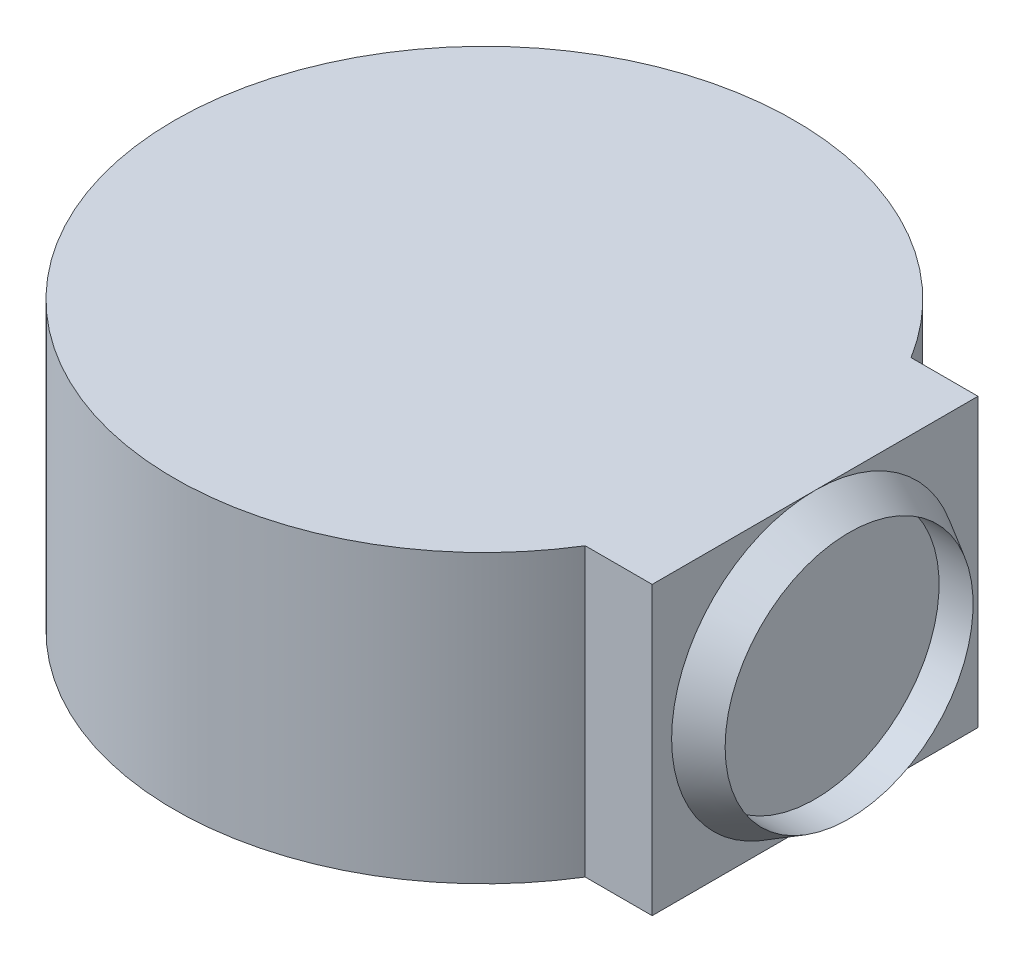
ISO-10303-21;
HEADER;
FILE_DESCRIPTION(('STEP AP214'),'2;1');
FILE_NAME('part.step','',(''),(''),'','','');
FILE_SCHEMA(('AUTOMOTIVE_DESIGN { 1 0 10303 214 1 1 1 1 }'));
ENDSEC;
DATA;
#1=APPLICATION_CONTEXT('core data for automotive mechanical design processes');
#2=APPLICATION_PROTOCOL_DEFINITION('international standard','automotive_design',2000,#1);
#3=PRODUCT_CONTEXT('',#1,'mechanical');
#4=PRODUCT('Part','Part','',(#3));
#5=PRODUCT_RELATED_PRODUCT_CATEGORY('part','',(#4));
#6=PRODUCT_DEFINITION_FORMATION('','',#4);
#7=PRODUCT_DEFINITION_CONTEXT('part definition',#1,'design');
#8=PRODUCT_DEFINITION('design','',#6,#7);
#9=PRODUCT_DEFINITION_SHAPE('','',#8);
#10=(LENGTH_UNIT() NAMED_UNIT(*) SI_UNIT(.MILLI.,.METRE.));
#11=(NAMED_UNIT(*) PLANE_ANGLE_UNIT() SI_UNIT($,.RADIAN.));
#12=(NAMED_UNIT(*) SI_UNIT($,.STERADIAN.) SOLID_ANGLE_UNIT());
#13=UNCERTAINTY_MEASURE_WITH_UNIT(LENGTH_MEASURE(1.E-05),#10,'distance_accuracy_value','');
#14=(GEOMETRIC_REPRESENTATION_CONTEXT(3) GLOBAL_UNCERTAINTY_ASSIGNED_CONTEXT((#13)) GLOBAL_UNIT_ASSIGNED_CONTEXT((#10,
#11,#12)) REPRESENTATION_CONTEXT('',''));
#15=CARTESIAN_POINT('',(0.,0.,0.));
#16=DIRECTION('',(0.,0.,1.));
#17=DIRECTION('',(1.,0.,0.));
#18=AXIS2_PLACEMENT_3D('',#15,#16,#17);
#19=CARTESIAN_POINT('',(170.,0.,0.));
#20=DIRECTION('',(1.,0.,0.));
#21=DIRECTION('',(0.,0.,-1.));
#22=AXIS2_PLACEMENT_3D('',#19,#20,#21);
#23=PLANE('',#22);
#24=DIRECTION('',(0.,0.,1.));
#25=VECTOR('',#24,1.);
#26=CARTESIAN_POINT('',(170.,147.5,-83.75));
#27=LINE('',#26,#25);
#28=CARTESIAN_POINT('',(170.,147.5,-83.75));
#29=VERTEX_POINT('',#28);
#30=CARTESIAN_POINT('',(170.,147.5,0.));
#31=VERTEX_POINT('',#30);
#32=EDGE_CURVE('E95',#29,#31,#27,.T.);
#33=ORIENTED_EDGE('',*,*,#32,.T.);
#34=CARTESIAN_POINT('',(170.,73.75,0.));
#35=DIRECTION('',(-1.,0.,0.));
#36=DIRECTION('',(0.,0.,1.));
#37=AXIS2_PLACEMENT_3D('',#34,#35,#36);
#38=CIRCLE('',#37,73.75);
#39=CARTESIAN_POINT('',(170.,0.,0.));
#40=VERTEX_POINT('',#39);
#41=EDGE_CURVE('E53',#31,#40,#38,.T.);
#42=ORIENTED_EDGE('',*,*,#41,.T.);
#43=DIRECTION('',(0.,0.,-1.));
#44=VECTOR('',#43,1.);
#45=CARTESIAN_POINT('',(170.,0.,83.75));
#46=LINE('',#45,#44);
#47=CARTESIAN_POINT('',(170.,0.,-83.75));
#48=VERTEX_POINT('',#47);
#49=EDGE_CURVE('E92',#40,#48,#46,.T.);
#50=ORIENTED_EDGE('',*,*,#49,.T.);
#51=DIRECTION('',(0.,1.,0.));
#52=VECTOR('',#51,1.);
#53=CARTESIAN_POINT('',(170.,0.,-83.75));
#54=LINE('',#53,#52);
#55=EDGE_CURVE('E112',#48,#29,#54,.T.);
#56=ORIENTED_EDGE('',*,*,#55,.T.);
#57=EDGE_LOOP('',(#33,#42,#50,#56));
#58=FACE_BOUND('',#57,.T.);
#59=ADVANCED_FACE('F39',(#58),#23,.T.);
#60=CARTESIAN_POINT('',(0.,147.5,0.));
#61=DIRECTION('',(0.,-1.,0.));
#62=DIRECTION('',(0.,0.,-1.));
#63=AXIS2_PLACEMENT_3D('',#60,#61,#62);
#64=CYLINDRICAL_SURFACE('',#63,159.375);
#65=DIRECTION('',(0.,-1.,0.));
#66=VECTOR('',#65,1.);
#67=CARTESIAN_POINT('',(135.596195097798,147.5,83.75));
#68=LINE('',#67,#66);
#69=CARTESIAN_POINT('',(135.596195097798,147.5,83.75));
#70=VERTEX_POINT('',#69);
#71=CARTESIAN_POINT('',(135.596195097798,0.,83.75));
#72=VERTEX_POINT('',#71);
#73=EDGE_CURVE('E61',#70,#72,#68,.T.);
#74=ORIENTED_EDGE('',*,*,#73,.F.);
#75=CARTESIAN_POINT('',(0.,147.5,0.));
#76=DIRECTION('',(0.,1.,0.));
#77=DIRECTION('',(0.,0.,1.));
#78=AXIS2_PLACEMENT_3D('',#75,#76,#77);
#79=CIRCLE('',#78,159.375);
#80=CARTESIAN_POINT('',(135.596195097798,147.5,-83.75));
#81=VERTEX_POINT('',#80);
#82=EDGE_CURVE('E131',#81,#70,#79,.T.);
#83=ORIENTED_EDGE('',*,*,#82,.F.);
#84=DIRECTION('',(0.,-1.,0.));
#85=VECTOR('',#84,1.);
#86=CARTESIAN_POINT('',(135.596195097798,147.5,-83.75));
#87=LINE('',#86,#85);
#88=CARTESIAN_POINT('',(135.596195097798,0.,-83.75));
#89=VERTEX_POINT('',#88);
#90=EDGE_CURVE('E126',#89,#81,#87,.F.);
#91=ORIENTED_EDGE('',*,*,#90,.F.);
#92=CARTESIAN_POINT('',(0.,0.,0.));
#93=DIRECTION('',(0.,1.,0.));
#94=DIRECTION('',(0.,0.,1.));
#95=AXIS2_PLACEMENT_3D('',#92,#93,#94);
#96=CIRCLE('',#95,159.375);
#97=EDGE_CURVE('E130',#89,#72,#96,.T.);
#98=ORIENTED_EDGE('',*,*,#97,.T.);
#99=EDGE_LOOP('',(#74,#83,#91,#98));
#100=FACE_BOUND('',#99,.T.);
#101=ADVANCED_FACE('F41',(#100),#64,.T.);
#102=CARTESIAN_POINT('',(0.,147.5,0.));
#103=DIRECTION('',(0.,1.,0.));
#104=DIRECTION('',(0.,0.,1.));
#105=AXIS2_PLACEMENT_3D('',#102,#103,#104);
#106=PLANE('',#105);
#107=ORIENTED_EDGE('',*,*,#82,.T.);
#108=DIRECTION('',(-1.,0.,0.));
#109=VECTOR('',#108,1.);
#110=CARTESIAN_POINT('',(170.,147.5,83.75));
#111=LINE('',#110,#109);
#112=CARTESIAN_POINT('',(170.,147.5,83.75));
#113=VERTEX_POINT('',#112);
#114=EDGE_CURVE('E123',#113,#70,#111,.T.);
#115=ORIENTED_EDGE('',*,*,#114,.F.);
#116=EDGE_CURVE('E96',#31,#113,#27,.T.);
#117=ORIENTED_EDGE('',*,*,#116,.F.);
#118=ORIENTED_EDGE('',*,*,#32,.F.);
#119=DIRECTION('',(-1.,0.,0.));
#120=VECTOR('',#119,1.);
#121=CARTESIAN_POINT('',(170.,147.5,-83.75));
#122=LINE('',#121,#120);
#123=EDGE_CURVE('E113',#29,#81,#122,.T.);
#124=ORIENTED_EDGE('',*,*,#123,.T.);
#125=EDGE_LOOP('',(#107,#115,#117,#118,#124));
#126=FACE_BOUND('',#125,.T.);
#127=ADVANCED_FACE('F136',(#126),#106,.T.);
#128=CARTESIAN_POINT('',(0.,0.,0.));
#129=DIRECTION('',(0.,1.,0.));
#130=DIRECTION('',(0.,0.,1.));
#131=AXIS2_PLACEMENT_3D('',#128,#129,#130);
#132=PLANE('',#131);
#133=CARTESIAN_POINT('',(0.,0.,0.));
#134=DIRECTION('',(0.,1.,0.));
#135=DIRECTION('',(0.,0.,1.));
#136=AXIS2_PLACEMENT_3D('',#133,#134,#135);
#137=CIRCLE('',#136,132.8125);
#138=CARTESIAN_POINT('',(0.,0.,132.8125));
#139=VERTEX_POINT('',#138);
#140=EDGE_CURVE('E11',#139,#139,#137,.F.);
#141=ORIENTED_EDGE('',*,*,#140,.F.);
#142=EDGE_LOOP('',(#141));
#143=FACE_BOUND('',#142,.T.);
#144=ORIENTED_EDGE('',*,*,#97,.F.);
#145=DIRECTION('',(-1.,0.,0.));
#146=VECTOR('',#145,1.);
#147=CARTESIAN_POINT('',(170.,0.,-83.75));
#148=LINE('',#147,#146);
#149=EDGE_CURVE('E105',#48,#89,#148,.T.);
#150=ORIENTED_EDGE('',*,*,#149,.F.);
#151=ORIENTED_EDGE('',*,*,#49,.F.);
#152=CARTESIAN_POINT('',(170.,0.,83.75));
#153=VERTEX_POINT('',#152);
#154=EDGE_CURVE('E103',#153,#40,#46,.T.);
#155=ORIENTED_EDGE('',*,*,#154,.F.);
#156=DIRECTION('',(-1.,0.,0.));
#157=VECTOR('',#156,1.);
#158=CARTESIAN_POINT('',(170.,0.,83.75));
#159=LINE('',#158,#157);
#160=EDGE_CURVE('E121',#153,#72,#159,.T.);
#161=ORIENTED_EDGE('',*,*,#160,.T.);
#162=EDGE_LOOP('',(#144,#150,#151,#155,#161));
#163=FACE_BOUND('',#162,.T.);
#164=ADVANCED_FACE('F101',(#143,#163),#132,.F.);
#165=CARTESIAN_POINT('',(170.,147.5,83.75));
#166=DIRECTION('',(0.,0.,-1.));
#167=DIRECTION('',(0.,1.,0.));
#168=AXIS2_PLACEMENT_3D('',#165,#166,#167);
#169=PLANE('',#168);
#170=ORIENTED_EDGE('',*,*,#114,.T.);
#171=ORIENTED_EDGE('',*,*,#73,.T.);
#172=ORIENTED_EDGE('',*,*,#160,.F.);
#173=DIRECTION('',(0.,-1.,0.));
#174=VECTOR('',#173,1.);
#175=CARTESIAN_POINT('',(170.,147.5,83.75));
#176=LINE('',#175,#174);
#177=EDGE_CURVE('E107',#113,#153,#176,.T.);
#178=ORIENTED_EDGE('',*,*,#177,.F.);
#179=EDGE_LOOP('',(#170,#171,#172,#178));
#180=FACE_BOUND('',#179,.T.);
#181=ADVANCED_FACE('F133',(#180),#169,.F.);
#182=CARTESIAN_POINT('',(170.,0.,-83.75));
#183=DIRECTION('',(0.,0.,1.));
#184=DIRECTION('',(1.,0.,0.));
#185=AXIS2_PLACEMENT_3D('',#182,#183,#184);
#186=PLANE('',#185);
#187=ORIENTED_EDGE('',*,*,#149,.T.);
#188=ORIENTED_EDGE('',*,*,#90,.T.);
#189=ORIENTED_EDGE('',*,*,#123,.F.);
#190=ORIENTED_EDGE('',*,*,#55,.F.);
#191=EDGE_LOOP('',(#187,#188,#189,#190));
#192=FACE_BOUND('',#191,.T.);
#193=ADVANCED_FACE('F139',(#192),#186,.F.);
#194=ORIENTED_EDGE('',*,*,#154,.T.);
#195=EDGE_CURVE('E47',#40,#31,#38,.T.);
#196=ORIENTED_EDGE('',*,*,#195,.T.);
#197=ORIENTED_EDGE('',*,*,#116,.T.);
#198=ORIENTED_EDGE('',*,*,#177,.T.);
#199=EDGE_LOOP('',(#194,#196,#197,#198));
#200=FACE_BOUND('',#199,.T.);
#201=ADVANCED_FACE('F109',(#200),#23,.T.);
#202=CARTESIAN_POINT('',(170.,73.75,0.));
#203=DIRECTION('',(-1.,0.,0.));
#204=DIRECTION('',(0.,0.,1.));
#205=AXIS2_PLACEMENT_3D('',#202,#203,#204);
#206=CONICAL_SURFACE('',#205,73.75,0.519146114246523);
#207=CARTESIAN_POINT('',(187.5,73.75,0.));
#208=DIRECTION('',(-1.,0.,0.));
#209=DIRECTION('',(0.,0.,1.));
#210=AXIS2_PLACEMENT_3D('',#207,#208,#209);
#211=CIRCLE('',#210,63.75);
#212=CARTESIAN_POINT('',(187.5,73.75,63.75));
#213=VERTEX_POINT('',#212);
#214=EDGE_CURVE('E97',#213,#213,#211,.T.);
#215=ORIENTED_EDGE('',*,*,#214,.T.);
#216=EDGE_LOOP('',(#215));
#217=FACE_BOUND('',#216,.T.);
#218=ORIENTED_EDGE('',*,*,#41,.F.);
#219=ORIENTED_EDGE('',*,*,#195,.F.);
#220=EDGE_LOOP('',(#218,#219));
#221=FACE_BOUND('',#220,.T.);
#222=ADVANCED_FACE('F83',(#217,#221),#206,.T.);
#223=CARTESIAN_POINT('',(170.,73.75,0.));
#224=DIRECTION('',(-1.,0.,0.));
#225=DIRECTION('',(0.,0.,1.));
#226=AXIS2_PLACEMENT_3D('',#223,#224,#225);
#227=CYLINDRICAL_SURFACE('',#226,63.75);
#228=CARTESIAN_POINT('',(170.,73.75,0.));
#229=DIRECTION('',(-1.,0.,0.));
#230=DIRECTION('',(0.,0.,1.));
#231=AXIS2_PLACEMENT_3D('',#228,#229,#230);
#232=CIRCLE('',#231,63.75);
#233=CARTESIAN_POINT('',(170.,73.75,63.75));
#234=VERTEX_POINT('',#233);
#235=EDGE_CURVE('E87',#234,#234,#232,.T.);
#236=ORIENTED_EDGE('',*,*,#235,.T.);
#237=EDGE_LOOP('',(#236));
#238=FACE_BOUND('',#237,.T.);
#239=ORIENTED_EDGE('',*,*,#214,.F.);
#240=EDGE_LOOP('',(#239));
#241=FACE_BOUND('',#240,.T.);
#242=ADVANCED_FACE('F175',(#238,#241),#227,.F.);
#243=ORIENTED_EDGE('',*,*,#235,.F.);
#244=EDGE_LOOP('',(#243));
#245=FACE_BOUND('',#244,.T.);
#246=ADVANCED_FACE('F154',(#245),#23,.T.);
#247=CARTESIAN_POINT('',(0.,-10.,0.));
#248=DIRECTION('',(0.,1.,0.));
#249=DIRECTION('',(0.,0.,1.));
#250=AXIS2_PLACEMENT_3D('',#247,#248,#249);
#251=CYLINDRICAL_SURFACE('',#250,132.8125);
#252=CARTESIAN_POINT('',(0.,-10.,0.));
#253=DIRECTION('',(0.,-1.,0.));
#254=DIRECTION('',(0.,0.,-1.));
#255=AXIS2_PLACEMENT_3D('',#252,#253,#254);
#256=CIRCLE('',#255,132.8125);
#257=CARTESIAN_POINT('',(0.,-10.,-132.8125));
#258=VERTEX_POINT('',#257);
#259=EDGE_CURVE('E145',#258,#258,#256,.T.);
#260=ORIENTED_EDGE('',*,*,#259,.F.);
#261=EDGE_LOOP('',(#260));
#262=FACE_BOUND('',#261,.T.);
#263=ORIENTED_EDGE('',*,*,#140,.T.);
#264=EDGE_LOOP('',(#263));
#265=FACE_BOUND('',#264,.T.);
#266=ADVANCED_FACE('F151',(#262,#265),#251,.T.);
#267=CARTESIAN_POINT('',(0.,-10.,0.));
#268=DIRECTION('',(0.,-1.,0.));
#269=DIRECTION('',(0.,0.,-1.));
#270=AXIS2_PLACEMENT_3D('',#267,#268,#269);
#271=PLANE('',#270);
#272=ORIENTED_EDGE('',*,*,#259,.T.);
#273=EDGE_LOOP('',(#272));
#274=FACE_BOUND('',#273,.T.);
#275=ADVANCED_FACE('F149',(#274),#271,.T.);
#276=CLOSED_SHELL('',(#59,#101,#127,#164,#181,#193,#201,#222,#242,#246,#266,#275));
#277=MANIFOLD_SOLID_BREP('B2',#276);
#278=ADVANCED_BREP_SHAPE_REPRESENTATION('',(#18,#277),#14);
#279=SHAPE_DEFINITION_REPRESENTATION(#9,#278);
ENDSEC;
END-ISO-10303-21;
